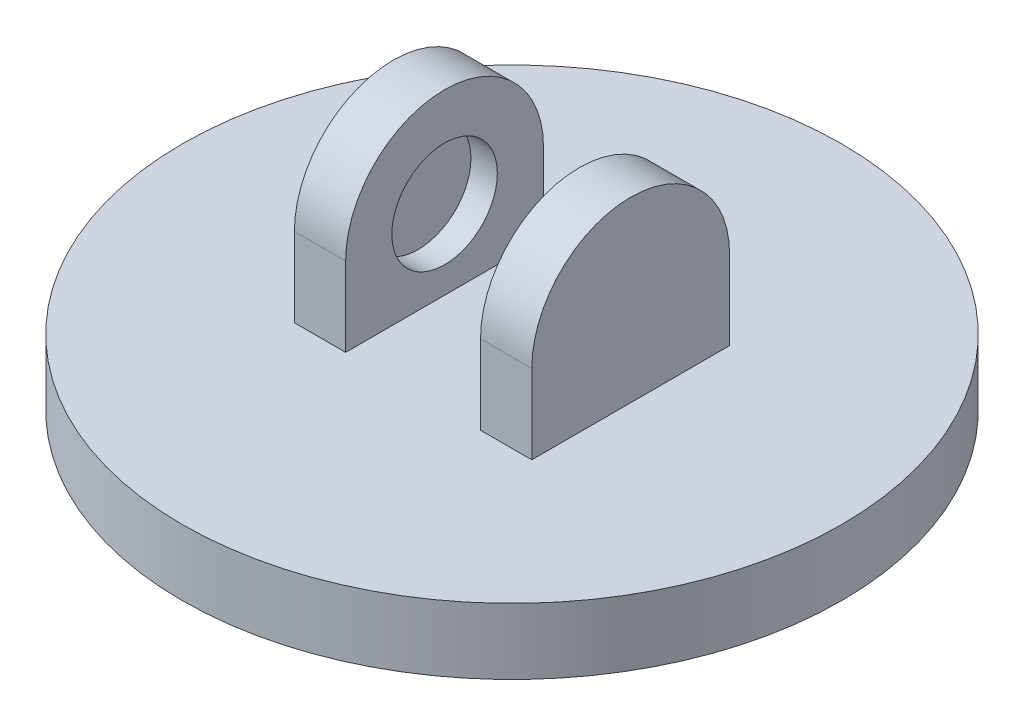
ISO-10303-21;
HEADER;
FILE_DESCRIPTION(('STEP AP214'),'2;1');
FILE_NAME('part.step','',(''),(''),'','','');
FILE_SCHEMA(('AUTOMOTIVE_DESIGN { 1 0 10303 214 1 1 1 1 }'));
ENDSEC;
DATA;
#1=APPLICATION_CONTEXT('core data for automotive mechanical design processes');
#2=APPLICATION_PROTOCOL_DEFINITION('international standard','automotive_design',2000,#1);
#3=PRODUCT_CONTEXT('',#1,'mechanical');
#4=PRODUCT('Part','Part','',(#3));
#5=PRODUCT_RELATED_PRODUCT_CATEGORY('part','',(#4));
#6=PRODUCT_DEFINITION_FORMATION('','',#4);
#7=PRODUCT_DEFINITION_CONTEXT('part definition',#1,'design');
#8=PRODUCT_DEFINITION('design','',#6,#7);
#9=PRODUCT_DEFINITION_SHAPE('','',#8);
#10=(LENGTH_UNIT() NAMED_UNIT(*) SI_UNIT(.MILLI.,.METRE.));
#11=(NAMED_UNIT(*) PLANE_ANGLE_UNIT() SI_UNIT($,.RADIAN.));
#12=(NAMED_UNIT(*) SI_UNIT($,.STERADIAN.) SOLID_ANGLE_UNIT());
#13=UNCERTAINTY_MEASURE_WITH_UNIT(LENGTH_MEASURE(1.E-05),#10,'distance_accuracy_value','');
#14=(GEOMETRIC_REPRESENTATION_CONTEXT(3) GLOBAL_UNCERTAINTY_ASSIGNED_CONTEXT((#13)) GLOBAL_UNIT_ASSIGNED_CONTEXT((#10,
#11,#12)) REPRESENTATION_CONTEXT('',''));
#15=CARTESIAN_POINT('',(0.,0.,0.));
#16=DIRECTION('',(0.,0.,1.));
#17=DIRECTION('',(1.,0.,0.));
#18=AXIS2_PLACEMENT_3D('',#15,#16,#17);
#19=CARTESIAN_POINT('',(51.1335813679656,110.,-105.));
#20=DIRECTION('',(1.,0.,0.));
#21=DIRECTION('',(0.,0.,-1.));
#22=AXIS2_PLACEMENT_3D('',#19,#20,#21);
#23=PLANE('',#22);
#24=CARTESIAN_POINT('',(51.1335813679656,110.,0.));
#25=DIRECTION('',(-1.,0.,0.));
#26=DIRECTION('',(0.,0.,1.));
#27=AXIS2_PLACEMENT_3D('',#24,#25,#26);
#28=CIRCLE('',#27,40.);
#29=CARTESIAN_POINT('',(51.1335813679656,110.,40.));
#30=VERTEX_POINT('',#29);
#31=EDGE_CURVE('E173',#30,#30,#28,.T.);
#32=ORIENTED_EDGE('',*,*,#31,.F.);
#33=EDGE_LOOP('',(#32));
#34=FACE_BOUND('',#33,.T.);
#35=DIRECTION('',(0.,0.,1.));
#36=VECTOR('',#35,1.);
#37=CARTESIAN_POINT('',(51.1335786320344,50.,-333.));
#38=LINE('',#37,#36);
#39=CARTESIAN_POINT('',(51.1335786320344,50.,-75.));
#40=VERTEX_POINT('',#39);
#41=CARTESIAN_POINT('',(51.1335786320344,50.,75.));
#42=VERTEX_POINT('',#41);
#43=EDGE_CURVE('E108',#40,#42,#38,.T.);
#44=ORIENTED_EDGE('',*,*,#43,.T.);
#45=DIRECTION('',(0.,1.,0.));
#46=VECTOR('',#45,1.);
#47=CARTESIAN_POINT('',(51.1335786320344,110.,75.));
#48=LINE('',#47,#46);
#49=CARTESIAN_POINT('',(51.1335786320344,110.,75.));
#50=VERTEX_POINT('',#49);
#51=EDGE_CURVE('E109',#42,#50,#48,.T.);
#52=ORIENTED_EDGE('',*,*,#51,.T.);
#53=CARTESIAN_POINT('',(51.1335813679656,110.,0.));
#54=DIRECTION('',(1.,0.,0.));
#55=DIRECTION('',(0.,0.,-1.));
#56=AXIS2_PLACEMENT_3D('',#53,#54,#55);
#57=CIRCLE('',#56,75.);
#58=CARTESIAN_POINT('',(51.1335786320344,110.,-75.));
#59=VERTEX_POINT('',#58);
#60=EDGE_CURVE('E11',#59,#50,#57,.T.);
#61=ORIENTED_EDGE('',*,*,#60,.F.);
#62=DIRECTION('',(0.,1.,0.));
#63=VECTOR('',#62,1.);
#64=CARTESIAN_POINT('',(51.1335786320344,170.,-75.));
#65=LINE('',#64,#63);
#66=EDGE_CURVE('E152',#40,#59,#65,.T.);
#67=ORIENTED_EDGE('',*,*,#66,.F.);
#68=EDGE_LOOP('',(#44,#52,#61,#67));
#69=FACE_BOUND('',#68,.T.);
#70=ADVANCED_FACE('F32',(#34,#69),#23,.F.);
#71=CARTESIAN_POINT('',(-51.1335813679656,110.,-105.));
#72=DIRECTION('',(1.,0.,0.));
#73=DIRECTION('',(0.,0.,-1.));
#74=AXIS2_PLACEMENT_3D('',#71,#72,#73);
#75=PLANE('',#74);
#76=CARTESIAN_POINT('',(-51.1335813679656,110.,0.));
#77=DIRECTION('',(1.,0.,0.));
#78=DIRECTION('',(0.,0.,-1.));
#79=AXIS2_PLACEMENT_3D('',#76,#77,#78);
#80=CIRCLE('',#79,40.);
#81=CARTESIAN_POINT('',(-51.1335813679656,110.,-40.));
#82=VERTEX_POINT('',#81);
#83=EDGE_CURVE('E157',#82,#82,#80,.T.);
#84=ORIENTED_EDGE('',*,*,#83,.F.);
#85=EDGE_LOOP('',(#84));
#86=FACE_BOUND('',#85,.T.);
#87=DIRECTION('',(0.,-1.,0.));
#88=VECTOR('',#87,1.);
#89=CARTESIAN_POINT('',(-51.1335813679656,110.,75.));
#90=LINE('',#89,#88);
#91=CARTESIAN_POINT('',(-51.1335813679656,110.,75.));
#92=VERTEX_POINT('',#91);
#93=CARTESIAN_POINT('',(-51.1335813679656,50.,75.));
#94=VERTEX_POINT('',#93);
#95=EDGE_CURVE('E112',#92,#94,#90,.T.);
#96=ORIENTED_EDGE('',*,*,#95,.T.);
#97=DIRECTION('',(0.,0.,1.));
#98=VECTOR('',#97,1.);
#99=CARTESIAN_POINT('',(-51.1335813679656,50.,-333.));
#100=LINE('',#99,#98);
#101=CARTESIAN_POINT('',(-51.1335813679656,50.,-75.));
#102=VERTEX_POINT('',#101);
#103=EDGE_CURVE('E100',#102,#94,#100,.T.);
#104=ORIENTED_EDGE('',*,*,#103,.F.);
#105=DIRECTION('',(0.,-1.,0.));
#106=VECTOR('',#105,1.);
#107=CARTESIAN_POINT('',(-51.1335813679656,170.,-75.));
#108=LINE('',#107,#106);
#109=CARTESIAN_POINT('',(-51.1335813679656,110.,-75.));
#110=VERTEX_POINT('',#109);
#111=EDGE_CURVE('E158',#110,#102,#108,.T.);
#112=ORIENTED_EDGE('',*,*,#111,.F.);
#113=CARTESIAN_POINT('',(-51.1335813679656,110.,0.));
#114=DIRECTION('',(1.,0.,0.));
#115=DIRECTION('',(0.,0.,-1.));
#116=AXIS2_PLACEMENT_3D('',#113,#114,#115);
#117=CIRCLE('',#116,75.);
#118=EDGE_CURVE('E40',#110,#92,#117,.T.);
#119=ORIENTED_EDGE('',*,*,#118,.T.);
#120=EDGE_LOOP('',(#96,#104,#112,#119));
#121=FACE_BOUND('',#120,.T.);
#122=ADVANCED_FACE('F113',(#86,#121),#75,.T.);
#123=CARTESIAN_POINT('',(90.,170.,75.));
#124=DIRECTION('',(0.,0.,-1.));
#125=DIRECTION('',(-1.,0.,0.));
#126=AXIS2_PLACEMENT_3D('',#123,#124,#125);
#127=PLANE('',#126);
#128=DIRECTION('',(1.,0.,0.));
#129=VECTOR('',#128,1.);
#130=CARTESIAN_POINT('',(90.,50.,75.));
#131=LINE('',#130,#129);
#132=CARTESIAN_POINT('',(-90.,50.,75.));
#133=VERTEX_POINT('',#132);
#134=EDGE_CURVE('E106',#133,#94,#131,.T.);
#135=ORIENTED_EDGE('',*,*,#134,.T.);
#136=ORIENTED_EDGE('',*,*,#95,.F.);
#137=DIRECTION('',(-1.,0.,0.));
#138=VECTOR('',#137,1.);
#139=CARTESIAN_POINT('',(90.,110.,75.));
#140=LINE('',#139,#138);
#141=CARTESIAN_POINT('',(-90.,110.,75.));
#142=VERTEX_POINT('',#141);
#143=EDGE_CURVE('E163',#92,#142,#140,.T.);
#144=ORIENTED_EDGE('',*,*,#143,.T.);
#145=DIRECTION('',(0.,-1.,0.));
#146=VECTOR('',#145,1.);
#147=CARTESIAN_POINT('',(-90.,170.,75.));
#148=LINE('',#147,#146);
#149=EDGE_CURVE('E121',#142,#133,#148,.T.);
#150=ORIENTED_EDGE('',*,*,#149,.T.);
#151=EDGE_LOOP('',(#135,#136,#144,#150));
#152=FACE_BOUND('',#151,.T.);
#153=ADVANCED_FACE('F119',(#152),#127,.F.);
#154=CARTESIAN_POINT('',(90.,170.,-75.));
#155=DIRECTION('',(0.,0.,1.));
#156=DIRECTION('',(1.,0.,0.));
#157=AXIS2_PLACEMENT_3D('',#154,#155,#156);
#158=PLANE('',#157);
#159=DIRECTION('',(-1.,0.,0.));
#160=VECTOR('',#159,1.);
#161=CARTESIAN_POINT('',(90.,110.,-75.));
#162=LINE('',#161,#160);
#163=CARTESIAN_POINT('',(-90.,110.,-75.));
#164=VERTEX_POINT('',#163);
#165=EDGE_CURVE('E164',#110,#164,#162,.T.);
#166=ORIENTED_EDGE('',*,*,#165,.F.);
#167=ORIENTED_EDGE('',*,*,#111,.T.);
#168=DIRECTION('',(-1.,0.,0.));
#169=VECTOR('',#168,1.);
#170=CARTESIAN_POINT('',(90.,50.,-75.));
#171=LINE('',#170,#169);
#172=CARTESIAN_POINT('',(-90.,50.,-75.));
#173=VERTEX_POINT('',#172);
#174=EDGE_CURVE('E55',#102,#173,#171,.T.);
#175=ORIENTED_EDGE('',*,*,#174,.T.);
#176=DIRECTION('',(0.,-1.,0.));
#177=VECTOR('',#176,1.);
#178=CARTESIAN_POINT('',(-90.,170.,-75.));
#179=LINE('',#178,#177);
#180=EDGE_CURVE('E133',#164,#173,#179,.T.);
#181=ORIENTED_EDGE('',*,*,#180,.F.);
#182=EDGE_LOOP('',(#166,#167,#175,#181));
#183=FACE_BOUND('',#182,.T.);
#184=ADVANCED_FACE('F204',(#183),#158,.F.);
#185=CARTESIAN_POINT('',(-90.,110.,0.));
#186=DIRECTION('',(1.,0.,0.));
#187=DIRECTION('',(0.,0.,-1.));
#188=AXIS2_PLACEMENT_3D('',#185,#186,#187);
#189=CYLINDRICAL_SURFACE('',#188,75.);
#190=ORIENTED_EDGE('',*,*,#118,.F.);
#191=ORIENTED_EDGE('',*,*,#165,.T.);
#192=CARTESIAN_POINT('',(-90.,110.,0.));
#193=DIRECTION('',(-1.,0.,0.));
#194=DIRECTION('',(0.,0.,1.));
#195=AXIS2_PLACEMENT_3D('',#192,#193,#194);
#196=CIRCLE('',#195,75.);
#197=EDGE_CURVE('E167',#142,#164,#196,.T.);
#198=ORIENTED_EDGE('',*,*,#197,.F.);
#199=ORIENTED_EDGE('',*,*,#143,.F.);
#200=EDGE_LOOP('',(#190,#191,#198,#199));
#201=FACE_BOUND('',#200,.T.);
#202=ADVANCED_FACE('F196',(#201),#189,.T.);
#203=CARTESIAN_POINT('',(0.,50.,0.));
#204=DIRECTION('',(0.,1.,0.));
#205=DIRECTION('',(0.,0.,1.));
#206=AXIS2_PLACEMENT_3D('',#203,#204,#205);
#207=PLANE('',#206);
#208=ORIENTED_EDGE('',*,*,#103,.T.);
#209=ORIENTED_EDGE('',*,*,#134,.F.);
#210=DIRECTION('',(0.,0.,1.));
#211=VECTOR('',#210,1.);
#212=CARTESIAN_POINT('',(-90.,50.,75.));
#213=LINE('',#212,#211);
#214=EDGE_CURVE('E127',#173,#133,#213,.T.);
#215=ORIENTED_EDGE('',*,*,#214,.F.);
#216=ORIENTED_EDGE('',*,*,#174,.F.);
#217=EDGE_LOOP('',(#208,#209,#215,#216));
#218=FACE_BOUND('',#217,.T.);
#219=CARTESIAN_POINT('',(90.,50.,75.));
#220=VERTEX_POINT('',#219);
#221=EDGE_CURVE('E124',#42,#220,#131,.T.);
#222=ORIENTED_EDGE('',*,*,#221,.F.);
#223=ORIENTED_EDGE('',*,*,#43,.F.);
#224=CARTESIAN_POINT('',(90.,50.,-75.));
#225=VERTEX_POINT('',#224);
#226=EDGE_CURVE('E131',#225,#40,#171,.T.);
#227=ORIENTED_EDGE('',*,*,#226,.F.);
#228=DIRECTION('',(0.,0.,-1.));
#229=VECTOR('',#228,1.);
#230=CARTESIAN_POINT('',(90.,50.,75.));
#231=LINE('',#230,#229);
#232=EDGE_CURVE('E123',#220,#225,#231,.T.);
#233=ORIENTED_EDGE('',*,*,#232,.F.);
#234=EDGE_LOOP('',(#222,#223,#227,#233));
#235=FACE_BOUND('',#234,.T.);
#236=CARTESIAN_POINT('',(0.,50.,0.));
#237=DIRECTION('',(0.,-1.,0.));
#238=DIRECTION('',(0.,0.,-1.));
#239=AXIS2_PLACEMENT_3D('',#236,#237,#238);
#240=CIRCLE('',#239,250.);
#241=CARTESIAN_POINT('',(0.,50.,-250.));
#242=VERTEX_POINT('',#241);
#243=EDGE_CURVE('E117',#242,#242,#240,.T.);
#244=ORIENTED_EDGE('',*,*,#243,.F.);
#245=EDGE_LOOP('',(#244));
#246=FACE_BOUND('',#245,.T.);
#247=ADVANCED_FACE('F102',(#218,#235,#246),#207,.T.);
#248=CARTESIAN_POINT('',(-90.,170.,75.));
#249=DIRECTION('',(1.,0.,0.));
#250=DIRECTION('',(0.,0.,-1.));
#251=AXIS2_PLACEMENT_3D('',#248,#249,#250);
#252=PLANE('',#251);
#253=ORIENTED_EDGE('',*,*,#149,.F.);
#254=ORIENTED_EDGE('',*,*,#197,.T.);
#255=ORIENTED_EDGE('',*,*,#180,.T.);
#256=ORIENTED_EDGE('',*,*,#214,.T.);
#257=EDGE_LOOP('',(#253,#254,#255,#256));
#258=FACE_BOUND('',#257,.T.);
#259=ADVANCED_FACE('F195',(#258),#252,.F.);
#260=CARTESIAN_POINT('',(90.,110.,75.));
#261=VERTEX_POINT('',#260);
#262=EDGE_CURVE('E165',#261,#50,#140,.T.);
#263=ORIENTED_EDGE('',*,*,#262,.T.);
#264=ORIENTED_EDGE('',*,*,#51,.F.);
#265=ORIENTED_EDGE('',*,*,#221,.T.);
#266=DIRECTION('',(0.,-1.,0.));
#267=VECTOR('',#266,1.);
#268=CARTESIAN_POINT('',(90.,170.,75.));
#269=LINE('',#268,#267);
#270=EDGE_CURVE('E136',#261,#220,#269,.T.);
#271=ORIENTED_EDGE('',*,*,#270,.F.);
#272=EDGE_LOOP('',(#263,#264,#265,#271));
#273=FACE_BOUND('',#272,.T.);
#274=ADVANCED_FACE('F201',(#273),#127,.F.);
#275=CARTESIAN_POINT('',(90.,170.,75.));
#276=DIRECTION('',(-1.,0.,0.));
#277=DIRECTION('',(0.,0.,1.));
#278=AXIS2_PLACEMENT_3D('',#275,#276,#277);
#279=PLANE('',#278);
#280=DIRECTION('',(0.,-1.,0.));
#281=VECTOR('',#280,1.);
#282=CARTESIAN_POINT('',(90.,170.,-75.));
#283=LINE('',#282,#281);
#284=CARTESIAN_POINT('',(90.,110.,-75.));
#285=VERTEX_POINT('',#284);
#286=EDGE_CURVE('E47',#285,#225,#283,.T.);
#287=ORIENTED_EDGE('',*,*,#286,.F.);
#288=CARTESIAN_POINT('',(90.,110.,0.));
#289=DIRECTION('',(-1.,0.,0.));
#290=DIRECTION('',(0.,0.,1.));
#291=AXIS2_PLACEMENT_3D('',#288,#289,#290);
#292=CIRCLE('',#291,75.);
#293=EDGE_CURVE('E144',#261,#285,#292,.T.);
#294=ORIENTED_EDGE('',*,*,#293,.F.);
#295=ORIENTED_EDGE('',*,*,#270,.T.);
#296=ORIENTED_EDGE('',*,*,#232,.T.);
#297=EDGE_LOOP('',(#287,#294,#295,#296));
#298=FACE_BOUND('',#297,.T.);
#299=ADVANCED_FACE('F142',(#298),#279,.F.);
#300=ORIENTED_EDGE('',*,*,#226,.T.);
#301=ORIENTED_EDGE('',*,*,#66,.T.);
#302=EDGE_CURVE('E155',#285,#59,#162,.T.);
#303=ORIENTED_EDGE('',*,*,#302,.F.);
#304=ORIENTED_EDGE('',*,*,#286,.T.);
#305=EDGE_LOOP('',(#300,#301,#303,#304));
#306=FACE_BOUND('',#305,.T.);
#307=ADVANCED_FACE('F151',(#306),#158,.F.);
#308=ORIENTED_EDGE('',*,*,#302,.T.);
#309=ORIENTED_EDGE('',*,*,#60,.T.);
#310=ORIENTED_EDGE('',*,*,#262,.F.);
#311=ORIENTED_EDGE('',*,*,#293,.T.);
#312=EDGE_LOOP('',(#308,#309,#310,#311));
#313=FACE_BOUND('',#312,.T.);
#314=ADVANCED_FACE('F162',(#313),#189,.T.);
#315=CARTESIAN_POINT('',(71.1335813679656,110.,0.));
#316=DIRECTION('',(-1.,0.,0.));
#317=DIRECTION('',(0.,0.,1.));
#318=AXIS2_PLACEMENT_3D('',#315,#316,#317);
#319=CYLINDRICAL_SURFACE('',#318,40.);
#320=CARTESIAN_POINT('',(71.1335813679656,110.,0.));
#321=DIRECTION('',(-1.,0.,0.));
#322=DIRECTION('',(0.,0.,1.));
#323=AXIS2_PLACEMENT_3D('',#320,#321,#322);
#324=CIRCLE('',#323,40.);
#325=CARTESIAN_POINT('',(71.1335813679656,110.,40.));
#326=VERTEX_POINT('',#325);
#327=EDGE_CURVE('E170',#326,#326,#324,.T.);
#328=ORIENTED_EDGE('',*,*,#327,.F.);
#329=EDGE_LOOP('',(#328));
#330=FACE_BOUND('',#329,.T.);
#331=ORIENTED_EDGE('',*,*,#31,.T.);
#332=EDGE_LOOP('',(#331));
#333=FACE_BOUND('',#332,.T.);
#334=ADVANCED_FACE('F219',(#330,#333),#319,.F.);
#335=CARTESIAN_POINT('',(71.1335813679656,110.,0.));
#336=DIRECTION('',(-1.,0.,0.));
#337=DIRECTION('',(0.,0.,1.));
#338=AXIS2_PLACEMENT_3D('',#335,#336,#337);
#339=PLANE('',#338);
#340=ORIENTED_EDGE('',*,*,#327,.T.);
#341=EDGE_LOOP('',(#340));
#342=FACE_BOUND('',#341,.T.);
#343=ADVANCED_FACE('F268',(#342),#339,.T.);
#344=CARTESIAN_POINT('',(-71.1335813679656,110.,0.));
#345=DIRECTION('',(1.,0.,0.));
#346=DIRECTION('',(0.,0.,-1.));
#347=AXIS2_PLACEMENT_3D('',#344,#345,#346);
#348=CYLINDRICAL_SURFACE('',#347,40.);
#349=CARTESIAN_POINT('',(-71.1335813679656,110.,0.));
#350=DIRECTION('',(1.,0.,0.));
#351=DIRECTION('',(0.,0.,-1.));
#352=AXIS2_PLACEMENT_3D('',#349,#350,#351);
#353=CIRCLE('',#352,40.);
#354=CARTESIAN_POINT('',(-71.1335813679656,110.,-40.));
#355=VERTEX_POINT('',#354);
#356=EDGE_CURVE('E176',#355,#355,#353,.T.);
#357=ORIENTED_EDGE('',*,*,#356,.F.);
#358=EDGE_LOOP('',(#357));
#359=FACE_BOUND('',#358,.T.);
#360=ORIENTED_EDGE('',*,*,#83,.T.);
#361=EDGE_LOOP('',(#360));
#362=FACE_BOUND('',#361,.T.);
#363=ADVANCED_FACE('F275',(#359,#362),#348,.F.);
#364=CARTESIAN_POINT('',(-71.1335813679656,110.,0.));
#365=DIRECTION('',(1.,0.,0.));
#366=DIRECTION('',(0.,0.,-1.));
#367=AXIS2_PLACEMENT_3D('',#364,#365,#366);
#368=PLANE('',#367);
#369=ORIENTED_EDGE('',*,*,#356,.T.);
#370=EDGE_LOOP('',(#369));
#371=FACE_BOUND('',#370,.T.);
#372=ADVANCED_FACE('F279',(#371),#368,.T.);
#373=CARTESIAN_POINT('',(0.,50.,0.));
#374=DIRECTION('',(0.,-1.,0.));
#375=DIRECTION('',(0.,0.,-1.));
#376=AXIS2_PLACEMENT_3D('',#373,#374,#375);
#377=CYLINDRICAL_SURFACE('',#376,250.);
#378=ORIENTED_EDGE('',*,*,#243,.T.);
#379=EDGE_LOOP('',(#378));
#380=FACE_BOUND('',#379,.T.);
#381=CARTESIAN_POINT('',(0.,0.,0.));
#382=DIRECTION('',(0.,-1.,0.));
#383=DIRECTION('',(0.,0.,-1.));
#384=AXIS2_PLACEMENT_3D('',#381,#382,#383);
#385=CIRCLE('',#384,250.);
#386=CARTESIAN_POINT('',(0.,0.,-250.));
#387=VERTEX_POINT('',#386);
#388=EDGE_CURVE('E186',#387,#387,#385,.T.);
#389=ORIENTED_EDGE('',*,*,#388,.F.);
#390=EDGE_LOOP('',(#389));
#391=FACE_BOUND('',#390,.T.);
#392=ADVANCED_FACE('F192',(#380,#391),#377,.T.);
#393=CARTESIAN_POINT('',(0.,0.,0.));
#394=DIRECTION('',(0.,1.,0.));
#395=DIRECTION('',(0.,0.,1.));
#396=AXIS2_PLACEMENT_3D('',#393,#394,#395);
#397=PLANE('',#396);
#398=ORIENTED_EDGE('',*,*,#388,.T.);
#399=EDGE_LOOP('',(#398));
#400=FACE_BOUND('',#399,.T.);
#401=ADVANCED_FACE('F34',(#400),#397,.F.);
#402=CLOSED_SHELL('',(#70,#122,#153,#184,#202,#247,#259,#274,#299,#307,#314,#334,#343,#363,#372,
#392,#401));
#403=MANIFOLD_SOLID_BREP('B2',#402);
#404=ADVANCED_BREP_SHAPE_REPRESENTATION('',(#18,#403),#14);
#405=SHAPE_DEFINITION_REPRESENTATION(#9,#404);
ENDSEC;
END-ISO-10303-21;
